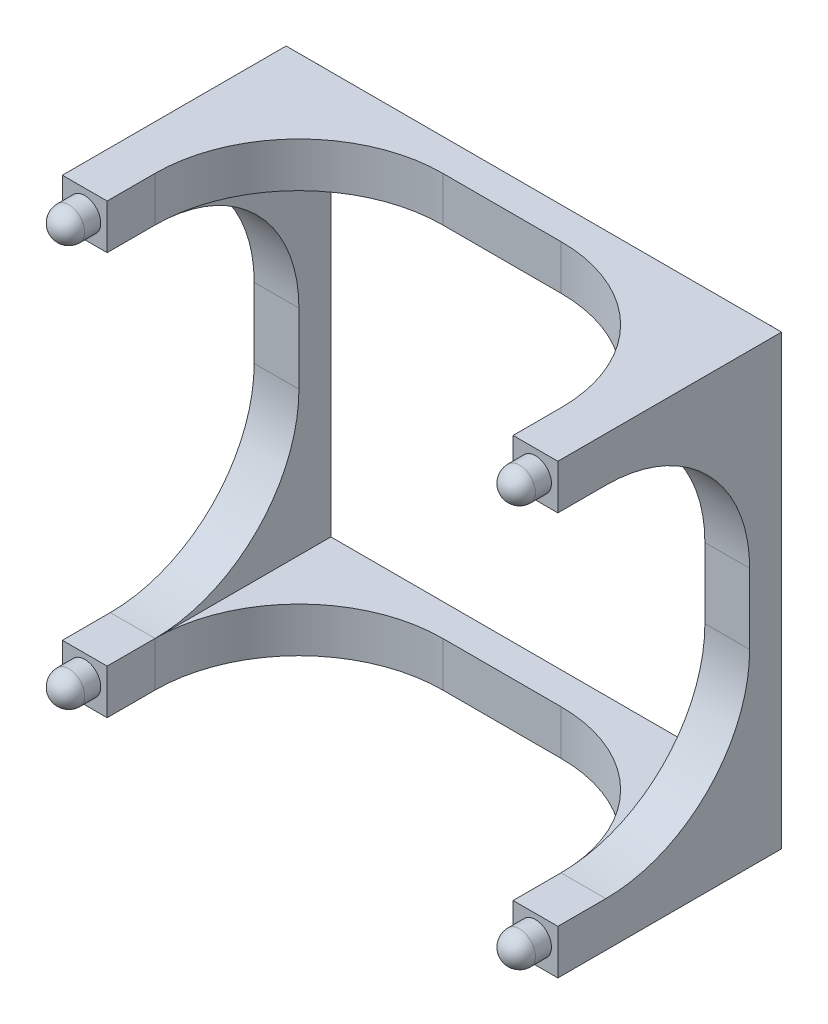
ISO-10303-21;
HEADER;
FILE_DESCRIPTION(('STEP AP214'),'2;1');
FILE_NAME('part.step','',(''),(''),'','','');
FILE_SCHEMA(('AUTOMOTIVE_DESIGN { 1 0 10303 214 1 1 1 1 }'));
ENDSEC;
DATA;
#1=APPLICATION_CONTEXT('core data for automotive mechanical design processes');
#2=APPLICATION_PROTOCOL_DEFINITION('international standard','automotive_design',2000,#1);
#3=PRODUCT_CONTEXT('',#1,'mechanical');
#4=PRODUCT('Part','Part','',(#3));
#5=PRODUCT_RELATED_PRODUCT_CATEGORY('part','',(#4));
#6=PRODUCT_DEFINITION_FORMATION('','',#4);
#7=PRODUCT_DEFINITION_CONTEXT('part definition',#1,'design');
#8=PRODUCT_DEFINITION('design','',#6,#7);
#9=PRODUCT_DEFINITION_SHAPE('','',#8);
#10=(LENGTH_UNIT() NAMED_UNIT(*) SI_UNIT(.MILLI.,.METRE.));
#11=(NAMED_UNIT(*) PLANE_ANGLE_UNIT() SI_UNIT($,.RADIAN.));
#12=(NAMED_UNIT(*) SI_UNIT($,.STERADIAN.) SOLID_ANGLE_UNIT());
#13=UNCERTAINTY_MEASURE_WITH_UNIT(LENGTH_MEASURE(1.E-05),#10,'distance_accuracy_value','');
#14=(GEOMETRIC_REPRESENTATION_CONTEXT(3) GLOBAL_UNCERTAINTY_ASSIGNED_CONTEXT((#13)) GLOBAL_UNIT_ASSIGNED_CONTEXT((#10,
#11,#12)) REPRESENTATION_CONTEXT('',''));
#15=CARTESIAN_POINT('',(0.,0.,0.));
#16=DIRECTION('',(0.,0.,1.));
#17=DIRECTION('',(1.,0.,0.));
#18=AXIS2_PLACEMENT_3D('',#15,#16,#17);
#19=CARTESIAN_POINT('',(63.5,56.,70.));
#20=DIRECTION('',(0.,1.,0.));
#21=DIRECTION('',(0.,0.,1.));
#22=AXIS2_PLACEMENT_3D('',#19,#20,#21);
#23=PLANE('',#22);
#24=DIRECTION('',(0.,0.,-1.));
#25=VECTOR('',#24,1.);
#26=CARTESIAN_POINT('',(-77.5,56.,70.));
#27=LINE('',#26,#25);
#28=CARTESIAN_POINT('',(-77.5,56.,70.));
#29=VERTEX_POINT('',#28);
#30=CARTESIAN_POINT('',(-77.5,56.,55.));
#31=VERTEX_POINT('',#30);
#32=EDGE_CURVE('E290',#29,#31,#27,.T.);
#33=ORIENTED_EDGE('',*,*,#32,.T.);
#34=DIRECTION('',(1.,0.,0.));
#35=VECTOR('',#34,1.);
#36=CARTESIAN_POINT('',(-63.5,56.,55.));
#37=LINE('',#36,#35);
#38=CARTESIAN_POINT('',(-63.5,56.,55.));
#39=VERTEX_POINT('',#38);
#40=EDGE_CURVE('E438',#31,#39,#37,.T.);
#41=ORIENTED_EDGE('',*,*,#40,.T.);
#42=DIRECTION('',(0.,0.,-1.));
#43=VECTOR('',#42,1.);
#44=CARTESIAN_POINT('',(-63.5,56.,70.));
#45=LINE('',#44,#43);
#46=CARTESIAN_POINT('',(-63.5,56.,70.));
#47=VERTEX_POINT('',#46);
#48=EDGE_CURVE('E287',#47,#39,#45,.T.);
#49=ORIENTED_EDGE('',*,*,#48,.F.);
#50=DIRECTION('',(1.,0.,0.));
#51=VECTOR('',#50,1.);
#52=CARTESIAN_POINT('',(-63.5,56.,70.));
#53=LINE('',#52,#51);
#54=EDGE_CURVE('E285',#29,#47,#53,.T.);
#55=ORIENTED_EDGE('',*,*,#54,.F.);
#56=EDGE_LOOP('',(#33,#41,#49,#55));
#57=FACE_BOUND('',#56,.T.);
#58=ADVANCED_FACE('F33',(#57),#23,.F.);
#59=DIRECTION('',(0.,0.,-1.));
#60=VECTOR('',#59,1.);
#61=CARTESIAN_POINT('',(63.5,56.,70.));
#62=LINE('',#61,#60);
#63=CARTESIAN_POINT('',(63.5,56.,70.));
#64=VERTEX_POINT('',#63);
#65=CARTESIAN_POINT('',(63.5,56.,55.));
#66=VERTEX_POINT('',#65);
#67=EDGE_CURVE('E274',#64,#66,#62,.T.);
#68=ORIENTED_EDGE('',*,*,#67,.T.);
#69=DIRECTION('',(1.,0.,0.));
#70=VECTOR('',#69,1.);
#71=CARTESIAN_POINT('',(77.5,56.,55.));
#72=LINE('',#71,#70);
#73=CARTESIAN_POINT('',(77.5,56.,55.));
#74=VERTEX_POINT('',#73);
#75=EDGE_CURVE('E435',#66,#74,#72,.T.);
#76=ORIENTED_EDGE('',*,*,#75,.T.);
#77=DIRECTION('',(0.,0.,-1.));
#78=VECTOR('',#77,1.);
#79=CARTESIAN_POINT('',(77.5,56.,70.));
#80=LINE('',#79,#78);
#81=CARTESIAN_POINT('',(77.5,56.,70.));
#82=VERTEX_POINT('',#81);
#83=EDGE_CURVE('E271',#82,#74,#80,.T.);
#84=ORIENTED_EDGE('',*,*,#83,.F.);
#85=DIRECTION('',(1.,0.,0.));
#86=VECTOR('',#85,1.);
#87=CARTESIAN_POINT('',(63.5,56.,70.));
#88=LINE('',#87,#86);
#89=EDGE_CURVE('E261',#64,#82,#88,.T.);
#90=ORIENTED_EDGE('',*,*,#89,.F.);
#91=EDGE_LOOP('',(#68,#76,#84,#90));
#92=FACE_BOUND('',#91,.T.);
#93=ADVANCED_FACE('F478',(#92),#23,.F.);
#94=CARTESIAN_POINT('',(-63.5,-56.,70.));
#95=DIRECTION('',(0.,-1.,0.));
#96=DIRECTION('',(0.,0.,-1.));
#97=AXIS2_PLACEMENT_3D('',#94,#95,#96);
#98=PLANE('',#97);
#99=DIRECTION('',(0.,0.,-1.));
#100=VECTOR('',#99,1.);
#101=CARTESIAN_POINT('',(77.5,-56.,70.));
#102=LINE('',#101,#100);
#103=CARTESIAN_POINT('',(77.5,-56.,70.));
#104=VERTEX_POINT('',#103);
#105=CARTESIAN_POINT('',(77.5,-56.,55.));
#106=VERTEX_POINT('',#105);
#107=EDGE_CURVE('E252',#104,#106,#102,.T.);
#108=ORIENTED_EDGE('',*,*,#107,.T.);
#109=DIRECTION('',(-1.,0.,0.));
#110=VECTOR('',#109,1.);
#111=CARTESIAN_POINT('',(63.5,-56.,55.));
#112=LINE('',#111,#110);
#113=CARTESIAN_POINT('',(63.5,-56.,55.));
#114=VERTEX_POINT('',#113);
#115=EDGE_CURVE('E428',#106,#114,#112,.T.);
#116=ORIENTED_EDGE('',*,*,#115,.T.);
#117=DIRECTION('',(0.,0.,-1.));
#118=VECTOR('',#117,1.);
#119=CARTESIAN_POINT('',(63.5,-56.,70.));
#120=LINE('',#119,#118);
#121=CARTESIAN_POINT('',(63.5,-56.,70.));
#122=VERTEX_POINT('',#121);
#123=EDGE_CURVE('E249',#122,#114,#120,.T.);
#124=ORIENTED_EDGE('',*,*,#123,.F.);
#125=DIRECTION('',(-1.,0.,0.));
#126=VECTOR('',#125,1.);
#127=CARTESIAN_POINT('',(63.5,-56.,70.));
#128=LINE('',#127,#126);
#129=EDGE_CURVE('E247',#104,#122,#128,.T.);
#130=ORIENTED_EDGE('',*,*,#129,.F.);
#131=EDGE_LOOP('',(#108,#116,#124,#130));
#132=FACE_BOUND('',#131,.T.);
#133=ADVANCED_FACE('F520',(#132),#98,.F.);
#134=DIRECTION('',(0.,0.,-1.));
#135=VECTOR('',#134,1.);
#136=CARTESIAN_POINT('',(-63.5,-56.,70.));
#137=LINE('',#136,#135);
#138=CARTESIAN_POINT('',(-63.5,-56.,70.));
#139=VERTEX_POINT('',#138);
#140=CARTESIAN_POINT('',(-63.5,-56.,55.));
#141=VERTEX_POINT('',#140);
#142=EDGE_CURVE('E211',#139,#141,#137,.T.);
#143=ORIENTED_EDGE('',*,*,#142,.T.);
#144=DIRECTION('',(-1.,0.,0.));
#145=VECTOR('',#144,1.);
#146=CARTESIAN_POINT('',(-77.5,-56.,55.));
#147=LINE('',#146,#145);
#148=CARTESIAN_POINT('',(-77.5,-56.,55.));
#149=VERTEX_POINT('',#148);
#150=EDGE_CURVE('E387',#141,#149,#147,.T.);
#151=ORIENTED_EDGE('',*,*,#150,.T.);
#152=DIRECTION('',(0.,0.,-1.));
#153=VECTOR('',#152,1.);
#154=CARTESIAN_POINT('',(-77.5,-56.,70.));
#155=LINE('',#154,#153);
#156=CARTESIAN_POINT('',(-77.5,-56.,70.));
#157=VERTEX_POINT('',#156);
#158=EDGE_CURVE('E214',#157,#149,#155,.T.);
#159=ORIENTED_EDGE('',*,*,#158,.F.);
#160=DIRECTION('',(-1.,0.,0.));
#161=VECTOR('',#160,1.);
#162=CARTESIAN_POINT('',(-63.5,-56.,70.));
#163=LINE('',#162,#161);
#164=EDGE_CURVE('E206',#139,#157,#163,.T.);
#165=ORIENTED_EDGE('',*,*,#164,.F.);
#166=EDGE_LOOP('',(#143,#151,#159,#165));
#167=FACE_BOUND('',#166,.T.);
#168=ADVANCED_FACE('F208',(#167),#98,.F.);
#169=CARTESIAN_POINT('',(0.,0.,10.));
#170=DIRECTION('',(0.,0.,-1.));
#171=DIRECTION('',(-1.,0.,0.));
#172=AXIS2_PLACEMENT_3D('',#169,#170,#171);
#173=PLANE('',#172);
#174=DIRECTION('',(1.,0.,0.));
#175=VECTOR('',#174,1.);
#176=CARTESIAN_POINT('',(-77.5,-70.,10.));
#177=LINE('',#176,#175);
#178=CARTESIAN_POINT('',(-18.5,-70.,10.));
#179=VERTEX_POINT('',#178);
#180=CARTESIAN_POINT('',(18.5,-70.,10.));
#181=VERTEX_POINT('',#180);
#182=EDGE_CURVE('E339',#179,#181,#177,.T.);
#183=ORIENTED_EDGE('',*,*,#182,.T.);
#184=DIRECTION('',(0.,-1.,0.));
#185=VECTOR('',#184,1.);
#186=CARTESIAN_POINT('',(18.5,-56.,10.));
#187=LINE('',#186,#185);
#188=CARTESIAN_POINT('',(18.5,-56.,10.));
#189=VERTEX_POINT('',#188);
#190=EDGE_CURVE('E411',#181,#189,#187,.F.);
#191=ORIENTED_EDGE('',*,*,#190,.T.);
#192=DIRECTION('',(1.,0.,0.));
#193=VECTOR('',#192,1.);
#194=CARTESIAN_POINT('',(-63.5,-56.,10.));
#195=LINE('',#194,#193);
#196=CARTESIAN_POINT('',(-18.5,-56.,10.));
#197=VERTEX_POINT('',#196);
#198=EDGE_CURVE('E306',#197,#189,#195,.T.);
#199=ORIENTED_EDGE('',*,*,#198,.F.);
#200=DIRECTION('',(0.,1.,0.));
#201=VECTOR('',#200,1.);
#202=CARTESIAN_POINT('',(-18.5,-70.,10.));
#203=LINE('',#202,#201);
#204=EDGE_CURVE('E380',#197,#179,#203,.F.);
#205=ORIENTED_EDGE('',*,*,#204,.T.);
#206=EDGE_LOOP('',(#183,#191,#199,#205));
#207=FACE_BOUND('',#206,.T.);
#208=ADVANCED_FACE('F556',(#207),#173,.F.);
#209=DIRECTION('',(0.,-1.,0.));
#210=VECTOR('',#209,1.);
#211=CARTESIAN_POINT('',(-63.5,-56.,10.));
#212=LINE('',#211,#210);
#213=CARTESIAN_POINT('',(-63.5,11.,10.));
#214=VERTEX_POINT('',#213);
#215=CARTESIAN_POINT('',(-63.5,-11.,10.));
#216=VERTEX_POINT('',#215);
#217=EDGE_CURVE('E304',#214,#216,#212,.T.);
#218=ORIENTED_EDGE('',*,*,#217,.F.);
#219=DIRECTION('',(1.,0.,0.));
#220=VECTOR('',#219,1.);
#221=CARTESIAN_POINT('',(-77.5,11.,10.));
#222=LINE('',#221,#220);
#223=CARTESIAN_POINT('',(-77.5,11.,10.));
#224=VERTEX_POINT('',#223);
#225=EDGE_CURVE('E55',#214,#224,#222,.F.);
#226=ORIENTED_EDGE('',*,*,#225,.T.);
#227=DIRECTION('',(0.,-1.,0.));
#228=VECTOR('',#227,1.);
#229=CARTESIAN_POINT('',(-77.5,-70.,10.));
#230=LINE('',#229,#228);
#231=CARTESIAN_POINT('',(-77.5,-11.,10.));
#232=VERTEX_POINT('',#231);
#233=EDGE_CURVE('E337',#224,#232,#230,.T.);
#234=ORIENTED_EDGE('',*,*,#233,.T.);
#235=DIRECTION('',(-1.,0.,0.));
#236=VECTOR('',#235,1.);
#237=CARTESIAN_POINT('',(-63.5,-11.,10.));
#238=LINE('',#237,#236);
#239=EDGE_CURVE('E389',#232,#216,#238,.F.);
#240=ORIENTED_EDGE('',*,*,#239,.T.);
#241=EDGE_LOOP('',(#218,#226,#234,#240));
#242=FACE_BOUND('',#241,.T.);
#243=ADVANCED_FACE('F546',(#242),#173,.F.);
#244=DIRECTION('',(0.,1.,0.));
#245=VECTOR('',#244,1.);
#246=CARTESIAN_POINT('',(63.5,-56.,10.));
#247=LINE('',#246,#245);
#248=CARTESIAN_POINT('',(63.5,-11.,10.));
#249=VERTEX_POINT('',#248);
#250=CARTESIAN_POINT('',(63.5,11.,10.));
#251=VERTEX_POINT('',#250);
#252=EDGE_CURVE('E297',#249,#251,#247,.T.);
#253=ORIENTED_EDGE('',*,*,#252,.F.);
#254=DIRECTION('',(-1.,0.,0.));
#255=VECTOR('',#254,1.);
#256=CARTESIAN_POINT('',(77.5,-11.,10.));
#257=LINE('',#256,#255);
#258=CARTESIAN_POINT('',(77.5,-11.,10.));
#259=VERTEX_POINT('',#258);
#260=EDGE_CURVE('E433',#249,#259,#257,.F.);
#261=ORIENTED_EDGE('',*,*,#260,.T.);
#262=DIRECTION('',(0.,1.,0.));
#263=VECTOR('',#262,1.);
#264=CARTESIAN_POINT('',(77.5,-70.,10.));
#265=LINE('',#264,#263);
#266=CARTESIAN_POINT('',(77.5,11.,10.));
#267=VERTEX_POINT('',#266);
#268=EDGE_CURVE('E330',#259,#267,#265,.T.);
#269=ORIENTED_EDGE('',*,*,#268,.T.);
#270=DIRECTION('',(1.,0.,0.));
#271=VECTOR('',#270,1.);
#272=CARTESIAN_POINT('',(63.5,11.,10.));
#273=LINE('',#272,#271);
#274=EDGE_CURVE('E431',#267,#251,#273,.F.);
#275=ORIENTED_EDGE('',*,*,#274,.T.);
#276=EDGE_LOOP('',(#253,#261,#269,#275));
#277=FACE_BOUND('',#276,.T.);
#278=ADVANCED_FACE('F459',(#277),#173,.F.);
#279=DIRECTION('',(-1.,0.,0.));
#280=VECTOR('',#279,1.);
#281=CARTESIAN_POINT('',(-77.5,70.,10.));
#282=LINE('',#281,#280);
#283=CARTESIAN_POINT('',(18.5,70.,10.));
#284=VERTEX_POINT('',#283);
#285=CARTESIAN_POINT('',(-18.5,70.,10.));
#286=VERTEX_POINT('',#285);
#287=EDGE_CURVE('E333',#284,#286,#282,.T.);
#288=ORIENTED_EDGE('',*,*,#287,.T.);
#289=DIRECTION('',(0.,1.,0.));
#290=VECTOR('',#289,1.);
#291=CARTESIAN_POINT('',(-18.5,56.,10.));
#292=LINE('',#291,#290);
#293=CARTESIAN_POINT('',(-18.5,56.,10.));
#294=VERTEX_POINT('',#293);
#295=EDGE_CURVE('E403',#286,#294,#292,.F.);
#296=ORIENTED_EDGE('',*,*,#295,.T.);
#297=DIRECTION('',(-1.,0.,0.));
#298=VECTOR('',#297,1.);
#299=CARTESIAN_POINT('',(-63.5,56.,10.));
#300=LINE('',#299,#298);
#301=CARTESIAN_POINT('',(18.5,56.,10.));
#302=VERTEX_POINT('',#301);
#303=EDGE_CURVE('E300',#302,#294,#300,.T.);
#304=ORIENTED_EDGE('',*,*,#303,.F.);
#305=DIRECTION('',(0.,-1.,0.));
#306=VECTOR('',#305,1.);
#307=CARTESIAN_POINT('',(18.5,70.,10.));
#308=LINE('',#307,#306);
#309=EDGE_CURVE('E401',#302,#284,#308,.F.);
#310=ORIENTED_EDGE('',*,*,#309,.T.);
#311=EDGE_LOOP('',(#288,#296,#304,#310));
#312=FACE_BOUND('',#311,.T.);
#313=ADVANCED_FACE('F487',(#312),#173,.F.);
#314=CARTESIAN_POINT('',(0.,0.,0.));
#315=DIRECTION('',(0.,0.,-1.));
#316=DIRECTION('',(-1.,0.,0.));
#317=AXIS2_PLACEMENT_3D('',#314,#315,#316);
#318=PLANE('',#317);
#319=CARTESIAN_POINT('',(70.5,-62.673227844293,0.));
#320=DIRECTION('',(0.,0.,-1.));
#321=DIRECTION('',(-1.,0.,0.));
#322=AXIS2_PLACEMENT_3D('',#319,#320,#321);
#323=CIRCLE('',#322,5.00000000000001);
#324=CARTESIAN_POINT('',(65.5,-62.673227844293,0.));
#325=VERTEX_POINT('',#324);
#326=EDGE_CURVE('E574',#325,#325,#323,.T.);
#327=ORIENTED_EDGE('',*,*,#326,.F.);
#328=EDGE_LOOP('',(#327));
#329=FACE_BOUND('',#328,.T.);
#330=CARTESIAN_POINT('',(70.5,63.,0.));
#331=DIRECTION('',(0.,0.,-1.));
#332=DIRECTION('',(-1.,0.,0.));
#333=AXIS2_PLACEMENT_3D('',#330,#331,#332);
#334=CIRCLE('',#333,5.00000000000001);
#335=CARTESIAN_POINT('',(65.5,63.,0.));
#336=VERTEX_POINT('',#335);
#337=EDGE_CURVE('E571',#336,#336,#334,.T.);
#338=ORIENTED_EDGE('',*,*,#337,.F.);
#339=EDGE_LOOP('',(#338));
#340=FACE_BOUND('',#339,.T.);
#341=CARTESIAN_POINT('',(-70.5,63.,0.));
#342=DIRECTION('',(0.,0.,-1.));
#343=DIRECTION('',(-1.,0.,0.));
#344=AXIS2_PLACEMENT_3D('',#341,#342,#343);
#345=CIRCLE('',#344,5.00000000000001);
#346=CARTESIAN_POINT('',(-75.5,63.,0.));
#347=VERTEX_POINT('',#346);
#348=EDGE_CURVE('E568',#347,#347,#345,.T.);
#349=ORIENTED_EDGE('',*,*,#348,.F.);
#350=EDGE_LOOP('',(#349));
#351=FACE_BOUND('',#350,.T.);
#352=CARTESIAN_POINT('',(-70.5,-62.673227844293,0.));
#353=DIRECTION('',(0.,0.,-1.));
#354=DIRECTION('',(-1.,0.,0.));
#355=AXIS2_PLACEMENT_3D('',#352,#353,#354);
#356=CIRCLE('',#355,5.00000000000001);
#357=CARTESIAN_POINT('',(-75.5,-62.673227844293,0.));
#358=VERTEX_POINT('',#357);
#359=EDGE_CURVE('E565',#358,#358,#356,.T.);
#360=ORIENTED_EDGE('',*,*,#359,.F.);
#361=EDGE_LOOP('',(#360));
#362=FACE_BOUND('',#361,.T.);
#363=DIRECTION('',(0.,1.,0.));
#364=VECTOR('',#363,1.);
#365=CARTESIAN_POINT('',(77.5,-70.,0.));
#366=LINE('',#365,#364);
#367=CARTESIAN_POINT('',(77.5,-70.,0.));
#368=VERTEX_POINT('',#367);
#369=CARTESIAN_POINT('',(77.5,70.,0.));
#370=VERTEX_POINT('',#369);
#371=EDGE_CURVE('E329',#368,#370,#366,.T.);
#372=ORIENTED_EDGE('',*,*,#371,.F.);
#373=DIRECTION('',(1.,0.,0.));
#374=VECTOR('',#373,1.);
#375=CARTESIAN_POINT('',(-77.5,-70.,0.));
#376=LINE('',#375,#374);
#377=CARTESIAN_POINT('',(-77.5,-70.,0.));
#378=VERTEX_POINT('',#377);
#379=EDGE_CURVE('E334',#378,#368,#376,.T.);
#380=ORIENTED_EDGE('',*,*,#379,.F.);
#381=DIRECTION('',(0.,-1.,0.));
#382=VECTOR('',#381,1.);
#383=CARTESIAN_POINT('',(-77.5,-70.,0.));
#384=LINE('',#383,#382);
#385=CARTESIAN_POINT('',(-77.5,70.,0.));
#386=VERTEX_POINT('',#385);
#387=EDGE_CURVE('E347',#386,#378,#384,.T.);
#388=ORIENTED_EDGE('',*,*,#387,.F.);
#389=DIRECTION('',(-1.,0.,0.));
#390=VECTOR('',#389,1.);
#391=CARTESIAN_POINT('',(-77.5,70.,0.));
#392=LINE('',#391,#390);
#393=EDGE_CURVE('E345',#370,#386,#392,.T.);
#394=ORIENTED_EDGE('',*,*,#393,.F.);
#395=EDGE_LOOP('',(#372,#380,#388,#394));
#396=FACE_BOUND('',#395,.T.);
#397=DIRECTION('',(1.,0.,0.));
#398=VECTOR('',#397,1.);
#399=CARTESIAN_POINT('',(-63.5,-56.,0.));
#400=LINE('',#399,#398);
#401=CARTESIAN_POINT('',(-63.5,-56.,0.));
#402=VERTEX_POINT('',#401);
#403=CARTESIAN_POINT('',(63.5,-56.,0.));
#404=VERTEX_POINT('',#403);
#405=EDGE_CURVE('E301',#402,#404,#400,.T.);
#406=ORIENTED_EDGE('',*,*,#405,.T.);
#407=DIRECTION('',(0.,1.,0.));
#408=VECTOR('',#407,1.);
#409=CARTESIAN_POINT('',(63.5,-56.,0.));
#410=LINE('',#409,#408);
#411=CARTESIAN_POINT('',(63.5,56.,0.));
#412=VERTEX_POINT('',#411);
#413=EDGE_CURVE('E296',#404,#412,#410,.T.);
#414=ORIENTED_EDGE('',*,*,#413,.T.);
#415=DIRECTION('',(-1.,0.,0.));
#416=VECTOR('',#415,1.);
#417=CARTESIAN_POINT('',(-63.5,56.,0.));
#418=LINE('',#417,#416);
#419=CARTESIAN_POINT('',(-63.5,56.,0.));
#420=VERTEX_POINT('',#419);
#421=EDGE_CURVE('E312',#412,#420,#418,.T.);
#422=ORIENTED_EDGE('',*,*,#421,.T.);
#423=DIRECTION('',(0.,-1.,0.));
#424=VECTOR('',#423,1.);
#425=CARTESIAN_POINT('',(-63.5,-56.,0.));
#426=LINE('',#425,#424);
#427=EDGE_CURVE('E315',#420,#402,#426,.T.);
#428=ORIENTED_EDGE('',*,*,#427,.T.);
#429=EDGE_LOOP('',(#406,#414,#422,#428));
#430=FACE_BOUND('',#429,.T.);
#431=ADVANCED_FACE('F497',(#329,#340,#351,#362,#396,#430),#318,.T.);
#432=CARTESIAN_POINT('',(77.5,-70.,10.));
#433=DIRECTION('',(-1.,0.,0.));
#434=DIRECTION('',(0.,0.,1.));
#435=AXIS2_PLACEMENT_3D('',#432,#433,#434);
#436=PLANE('',#435);
#437=ORIENTED_EDGE('',*,*,#371,.T.);
#438=DIRECTION('',(0.,0.,-1.));
#439=VECTOR('',#438,1.);
#440=CARTESIAN_POINT('',(77.5,70.,10.));
#441=LINE('',#440,#439);
#442=CARTESIAN_POINT('',(77.5,70.,70.));
#443=VERTEX_POINT('',#442);
#444=EDGE_CURVE('E358',#443,#370,#441,.T.);
#445=ORIENTED_EDGE('',*,*,#444,.F.);
#446=DIRECTION('',(0.,1.,0.));
#447=VECTOR('',#446,1.);
#448=CARTESIAN_POINT('',(77.5,56.,70.));
#449=LINE('',#448,#447);
#450=EDGE_CURVE('E263',#82,#443,#449,.T.);
#451=ORIENTED_EDGE('',*,*,#450,.F.);
#452=ORIENTED_EDGE('',*,*,#83,.T.);
#453=CARTESIAN_POINT('',(77.5,11.,55.));
#454=DIRECTION('',(-1.,0.,0.));
#455=DIRECTION('',(0.,0.,1.));
#456=AXIS2_PLACEMENT_3D('',#453,#454,#455);
#457=CIRCLE('',#456,45.);
#458=EDGE_CURVE('E41',#74,#267,#457,.T.);
#459=ORIENTED_EDGE('',*,*,#458,.T.);
#460=ORIENTED_EDGE('',*,*,#268,.F.);
#461=CARTESIAN_POINT('',(77.5,-11.,55.));
#462=DIRECTION('',(-1.,0.,0.));
#463=DIRECTION('',(0.,0.,1.));
#464=AXIS2_PLACEMENT_3D('',#461,#462,#463);
#465=CIRCLE('',#464,45.);
#466=EDGE_CURVE('E444',#259,#106,#465,.T.);
#467=ORIENTED_EDGE('',*,*,#466,.T.);
#468=ORIENTED_EDGE('',*,*,#107,.F.);
#469=DIRECTION('',(0.,1.,0.));
#470=VECTOR('',#469,1.);
#471=CARTESIAN_POINT('',(77.5,-56.,70.));
#472=LINE('',#471,#470);
#473=CARTESIAN_POINT('',(77.5,-70.,70.));
#474=VERTEX_POINT('',#473);
#475=EDGE_CURVE('E245',#474,#104,#472,.T.);
#476=ORIENTED_EDGE('',*,*,#475,.F.);
#477=DIRECTION('',(0.,0.,-1.));
#478=VECTOR('',#477,1.);
#479=CARTESIAN_POINT('',(77.5,-70.,10.));
#480=LINE('',#479,#478);
#481=EDGE_CURVE('E342',#474,#368,#480,.T.);
#482=ORIENTED_EDGE('',*,*,#481,.T.);
#483=EDGE_LOOP('',(#437,#445,#451,#452,#459,#460,#467,#468,#476,#482));
#484=FACE_BOUND('',#483,.T.);
#485=ADVANCED_FACE('F450',(#484),#436,.F.);
#486=CARTESIAN_POINT('',(-77.5,70.,10.));
#487=DIRECTION('',(0.,-1.,0.));
#488=DIRECTION('',(0.,0.,-1.));
#489=AXIS2_PLACEMENT_3D('',#486,#487,#488);
#490=PLANE('',#489);
#491=ORIENTED_EDGE('',*,*,#393,.T.);
#492=DIRECTION('',(0.,0.,-1.));
#493=VECTOR('',#492,1.);
#494=CARTESIAN_POINT('',(-77.5,70.,10.));
#495=LINE('',#494,#493);
#496=CARTESIAN_POINT('',(-77.5,70.,70.));
#497=VERTEX_POINT('',#496);
#498=EDGE_CURVE('E355',#497,#386,#495,.T.);
#499=ORIENTED_EDGE('',*,*,#498,.F.);
#500=DIRECTION('',(-1.,0.,0.));
#501=VECTOR('',#500,1.);
#502=CARTESIAN_POINT('',(-63.5,70.,70.));
#503=LINE('',#502,#501);
#504=CARTESIAN_POINT('',(-63.5,70.,70.));
#505=VERTEX_POINT('',#504);
#506=EDGE_CURVE('E280',#505,#497,#503,.T.);
#507=ORIENTED_EDGE('',*,*,#506,.F.);
#508=DIRECTION('',(0.,0.,-1.));
#509=VECTOR('',#508,1.);
#510=CARTESIAN_POINT('',(-63.5,70.,70.));
#511=LINE('',#510,#509);
#512=CARTESIAN_POINT('',(-63.5,70.,55.));
#513=VERTEX_POINT('',#512);
#514=EDGE_CURVE('E293',#505,#513,#511,.T.);
#515=ORIENTED_EDGE('',*,*,#514,.T.);
#516=CARTESIAN_POINT('',(-18.5,70.,55.));
#517=DIRECTION('',(0.,-1.,0.));
#518=DIRECTION('',(0.,0.,-1.));
#519=AXIS2_PLACEMENT_3D('',#516,#517,#518);
#520=CIRCLE('',#519,45.);
#521=EDGE_CURVE('E413',#513,#286,#520,.T.);
#522=ORIENTED_EDGE('',*,*,#521,.T.);
#523=ORIENTED_EDGE('',*,*,#287,.F.);
#524=CARTESIAN_POINT('',(18.5,70.,55.));
#525=DIRECTION('',(0.,-1.,0.));
#526=DIRECTION('',(0.,0.,-1.));
#527=AXIS2_PLACEMENT_3D('',#524,#525,#526);
#528=CIRCLE('',#527,45.);
#529=CARTESIAN_POINT('',(63.5,70.,55.));
#530=VERTEX_POINT('',#529);
#531=EDGE_CURVE('E421',#284,#530,#528,.T.);
#532=ORIENTED_EDGE('',*,*,#531,.T.);
#533=DIRECTION('',(0.,0.,-1.));
#534=VECTOR('',#533,1.);
#535=CARTESIAN_POINT('',(63.5,70.,70.));
#536=LINE('',#535,#534);
#537=CARTESIAN_POINT('',(63.5,70.,70.));
#538=VERTEX_POINT('',#537);
#539=EDGE_CURVE('E268',#538,#530,#536,.T.);
#540=ORIENTED_EDGE('',*,*,#539,.F.);
#541=DIRECTION('',(-1.,0.,0.));
#542=VECTOR('',#541,1.);
#543=CARTESIAN_POINT('',(63.5,70.,70.));
#544=LINE('',#543,#542);
#545=EDGE_CURVE('E266',#443,#538,#544,.T.);
#546=ORIENTED_EDGE('',*,*,#545,.F.);
#547=ORIENTED_EDGE('',*,*,#444,.T.);
#548=EDGE_LOOP('',(#491,#499,#507,#515,#522,#523,#532,#540,#546,#547));
#549=FACE_BOUND('',#548,.T.);
#550=ADVANCED_FACE('F483',(#549),#490,.F.);
#551=CARTESIAN_POINT('',(-77.5,-70.,10.));
#552=DIRECTION('',(1.,0.,0.));
#553=DIRECTION('',(0.,0.,-1.));
#554=AXIS2_PLACEMENT_3D('',#551,#552,#553);
#555=PLANE('',#554);
#556=ORIENTED_EDGE('',*,*,#387,.T.);
#557=DIRECTION('',(0.,0.,-1.));
#558=VECTOR('',#557,1.);
#559=CARTESIAN_POINT('',(-77.5,-70.,10.));
#560=LINE('',#559,#558);
#561=CARTESIAN_POINT('',(-77.5,-70.,70.));
#562=VERTEX_POINT('',#561);
#563=EDGE_CURVE('E352',#562,#378,#560,.T.);
#564=ORIENTED_EDGE('',*,*,#563,.F.);
#565=DIRECTION('',(0.,-1.,0.));
#566=VECTOR('',#565,1.);
#567=CARTESIAN_POINT('',(-77.5,-56.,70.));
#568=LINE('',#567,#566);
#569=EDGE_CURVE('E218',#157,#562,#568,.T.);
#570=ORIENTED_EDGE('',*,*,#569,.F.);
#571=ORIENTED_EDGE('',*,*,#158,.T.);
#572=CARTESIAN_POINT('',(-77.5,-11.,55.));
#573=DIRECTION('',(1.,0.,0.));
#574=DIRECTION('',(0.,0.,-1.));
#575=AXIS2_PLACEMENT_3D('',#572,#573,#574);
#576=CIRCLE('',#575,45.);
#577=EDGE_CURVE('E392',#149,#232,#576,.T.);
#578=ORIENTED_EDGE('',*,*,#577,.T.);
#579=ORIENTED_EDGE('',*,*,#233,.F.);
#580=CARTESIAN_POINT('',(-77.5,11.,55.));
#581=DIRECTION('',(1.,0.,0.));
#582=DIRECTION('',(0.,0.,-1.));
#583=AXIS2_PLACEMENT_3D('',#580,#581,#582);
#584=CIRCLE('',#583,45.);
#585=EDGE_CURVE('E447',#224,#31,#584,.T.);
#586=ORIENTED_EDGE('',*,*,#585,.T.);
#587=ORIENTED_EDGE('',*,*,#32,.F.);
#588=DIRECTION('',(0.,-1.,0.));
#589=VECTOR('',#588,1.);
#590=CARTESIAN_POINT('',(-77.5,56.,70.));
#591=LINE('',#590,#589);
#592=EDGE_CURVE('E283',#497,#29,#591,.T.);
#593=ORIENTED_EDGE('',*,*,#592,.F.);
#594=ORIENTED_EDGE('',*,*,#498,.T.);
#595=EDGE_LOOP('',(#556,#564,#570,#571,#578,#579,#586,#587,#593,#594));
#596=FACE_BOUND('',#595,.T.);
#597=ADVANCED_FACE('F530',(#596),#555,.F.);
#598=CARTESIAN_POINT('',(-77.5,-70.,10.));
#599=DIRECTION('',(0.,1.,0.));
#600=DIRECTION('',(0.,0.,1.));
#601=AXIS2_PLACEMENT_3D('',#598,#599,#600);
#602=PLANE('',#601);
#603=ORIENTED_EDGE('',*,*,#379,.T.);
#604=ORIENTED_EDGE('',*,*,#481,.F.);
#605=DIRECTION('',(1.,0.,0.));
#606=VECTOR('',#605,1.);
#607=CARTESIAN_POINT('',(63.5,-70.,70.));
#608=LINE('',#607,#606);
#609=CARTESIAN_POINT('',(63.5,-70.,70.));
#610=VERTEX_POINT('',#609);
#611=EDGE_CURVE('E237',#610,#474,#608,.T.);
#612=ORIENTED_EDGE('',*,*,#611,.F.);
#613=DIRECTION('',(0.,0.,-1.));
#614=VECTOR('',#613,1.);
#615=CARTESIAN_POINT('',(63.5,-70.,70.));
#616=LINE('',#615,#614);
#617=CARTESIAN_POINT('',(63.5,-70.,55.));
#618=VERTEX_POINT('',#617);
#619=EDGE_CURVE('E255',#610,#618,#616,.T.);
#620=ORIENTED_EDGE('',*,*,#619,.T.);
#621=CARTESIAN_POINT('',(18.5,-70.,55.));
#622=DIRECTION('',(0.,1.,0.));
#623=DIRECTION('',(0.,0.,1.));
#624=AXIS2_PLACEMENT_3D('',#621,#622,#623);
#625=CIRCLE('',#624,45.);
#626=EDGE_CURVE('E423',#618,#181,#625,.T.);
#627=ORIENTED_EDGE('',*,*,#626,.T.);
#628=ORIENTED_EDGE('',*,*,#182,.F.);
#629=CARTESIAN_POINT('',(-18.5,-70.,55.));
#630=DIRECTION('',(0.,1.,0.));
#631=DIRECTION('',(0.,0.,1.));
#632=AXIS2_PLACEMENT_3D('',#629,#630,#631);
#633=CIRCLE('',#632,45.);
#634=CARTESIAN_POINT('',(-63.5,-70.,55.));
#635=VERTEX_POINT('',#634);
#636=EDGE_CURVE('E385',#179,#635,#633,.T.);
#637=ORIENTED_EDGE('',*,*,#636,.T.);
#638=DIRECTION('',(0.,0.,-1.));
#639=VECTOR('',#638,1.);
#640=CARTESIAN_POINT('',(-63.5,-70.,70.));
#641=LINE('',#640,#639);
#642=CARTESIAN_POINT('',(-63.5,-70.,70.));
#643=VERTEX_POINT('',#642);
#644=EDGE_CURVE('E239',#643,#635,#641,.T.);
#645=ORIENTED_EDGE('',*,*,#644,.F.);
#646=DIRECTION('',(1.,0.,0.));
#647=VECTOR('',#646,1.);
#648=CARTESIAN_POINT('',(-63.5,-70.,70.));
#649=LINE('',#648,#647);
#650=EDGE_CURVE('E224',#562,#643,#649,.T.);
#651=ORIENTED_EDGE('',*,*,#650,.F.);
#652=ORIENTED_EDGE('',*,*,#563,.T.);
#653=EDGE_LOOP('',(#603,#604,#612,#620,#627,#628,#637,#645,#651,#652));
#654=FACE_BOUND('',#653,.T.);
#655=ADVANCED_FACE('F512',(#654),#602,.F.);
#656=CARTESIAN_POINT('',(63.5,-56.,10.));
#657=DIRECTION('',(-1.,0.,0.));
#658=DIRECTION('',(0.,0.,1.));
#659=AXIS2_PLACEMENT_3D('',#656,#657,#658);
#660=PLANE('',#659);
#661=ORIENTED_EDGE('',*,*,#413,.F.);
#662=DIRECTION('',(0.,0.,-1.));
#663=VECTOR('',#662,1.);
#664=CARTESIAN_POINT('',(63.5,-56.,10.));
#665=LINE('',#664,#663);
#666=EDGE_CURVE('E309',#114,#404,#665,.T.);
#667=ORIENTED_EDGE('',*,*,#666,.F.);
#668=CARTESIAN_POINT('',(63.5,-11.,55.));
#669=DIRECTION('',(-1.,0.,0.));
#670=DIRECTION('',(0.,0.,1.));
#671=AXIS2_PLACEMENT_3D('',#668,#669,#670);
#672=CIRCLE('',#671,45.);
#673=EDGE_CURVE('E442',#114,#249,#672,.F.);
#674=ORIENTED_EDGE('',*,*,#673,.T.);
#675=ORIENTED_EDGE('',*,*,#252,.T.);
#676=CARTESIAN_POINT('',(63.5,11.,55.));
#677=DIRECTION('',(-1.,0.,0.));
#678=DIRECTION('',(0.,0.,1.));
#679=AXIS2_PLACEMENT_3D('',#676,#677,#678);
#680=CIRCLE('',#679,45.);
#681=EDGE_CURVE('E11',#251,#66,#680,.F.);
#682=ORIENTED_EDGE('',*,*,#681,.T.);
#683=DIRECTION('',(0.,0.,-1.));
#684=VECTOR('',#683,1.);
#685=CARTESIAN_POINT('',(63.5,56.,10.));
#686=LINE('',#685,#684);
#687=EDGE_CURVE('E326',#66,#412,#686,.T.);
#688=ORIENTED_EDGE('',*,*,#687,.T.);
#689=EDGE_LOOP('',(#661,#667,#674,#675,#682,#688));
#690=FACE_BOUND('',#689,.T.);
#691=ADVANCED_FACE('F465',(#690),#660,.T.);
#692=CARTESIAN_POINT('',(-63.5,-56.,10.));
#693=DIRECTION('',(1.,0.,0.));
#694=DIRECTION('',(0.,0.,-1.));
#695=AXIS2_PLACEMENT_3D('',#692,#693,#694);
#696=PLANE('',#695);
#697=ORIENTED_EDGE('',*,*,#427,.F.);
#698=DIRECTION('',(0.,0.,-1.));
#699=VECTOR('',#698,1.);
#700=CARTESIAN_POINT('',(-63.5,56.,10.));
#701=LINE('',#700,#699);
#702=EDGE_CURVE('E324',#39,#420,#701,.T.);
#703=ORIENTED_EDGE('',*,*,#702,.F.);
#704=CARTESIAN_POINT('',(-63.5,11.,55.));
#705=DIRECTION('',(1.,0.,0.));
#706=DIRECTION('',(0.,0.,-1.));
#707=AXIS2_PLACEMENT_3D('',#704,#705,#706);
#708=CIRCLE('',#707,45.);
#709=EDGE_CURVE('E48',#39,#214,#708,.F.);
#710=ORIENTED_EDGE('',*,*,#709,.T.);
#711=ORIENTED_EDGE('',*,*,#217,.T.);
#712=CARTESIAN_POINT('',(-63.5,-11.,55.));
#713=DIRECTION('',(1.,0.,0.));
#714=DIRECTION('',(0.,0.,-1.));
#715=AXIS2_PLACEMENT_3D('',#712,#713,#714);
#716=CIRCLE('',#715,45.);
#717=EDGE_CURVE('E395',#216,#141,#716,.F.);
#718=ORIENTED_EDGE('',*,*,#717,.T.);
#719=DIRECTION('',(0.,0.,-1.));
#720=VECTOR('',#719,1.);
#721=CARTESIAN_POINT('',(-63.5,-56.,10.));
#722=LINE('',#721,#720);
#723=EDGE_CURVE('E322',#141,#402,#722,.T.);
#724=ORIENTED_EDGE('',*,*,#723,.T.);
#725=EDGE_LOOP('',(#697,#703,#710,#711,#718,#724));
#726=FACE_BOUND('',#725,.T.);
#727=ADVANCED_FACE('F494',(#726),#696,.T.);
#728=CARTESIAN_POINT('',(-63.5,56.,70.));
#729=DIRECTION('',(-1.,0.,0.));
#730=DIRECTION('',(0.,0.,1.));
#731=AXIS2_PLACEMENT_3D('',#728,#729,#730);
#732=PLANE('',#731);
#733=ORIENTED_EDGE('',*,*,#48,.T.);
#734=DIRECTION('',(0.,1.,0.));
#735=VECTOR('',#734,1.);
#736=CARTESIAN_POINT('',(-63.5,70.,55.));
#737=LINE('',#736,#735);
#738=EDGE_CURVE('E398',#39,#513,#737,.T.);
#739=ORIENTED_EDGE('',*,*,#738,.T.);
#740=ORIENTED_EDGE('',*,*,#514,.F.);
#741=DIRECTION('',(0.,1.,0.));
#742=VECTOR('',#741,1.);
#743=CARTESIAN_POINT('',(-63.5,56.,70.));
#744=LINE('',#743,#742);
#745=EDGE_CURVE('E277',#47,#505,#744,.T.);
#746=ORIENTED_EDGE('',*,*,#745,.F.);
#747=EDGE_LOOP('',(#733,#739,#740,#746));
#748=FACE_BOUND('',#747,.T.);
#749=ADVANCED_FACE('F539',(#748),#732,.F.);
#750=CARTESIAN_POINT('',(0.,0.,70.));
#751=DIRECTION('',(0.,0.,1.));
#752=DIRECTION('',(1.,0.,0.));
#753=AXIS2_PLACEMENT_3D('',#750,#751,#752);
#754=PLANE('',#753);
#755=CARTESIAN_POINT('',(-70.5,63.,70.));
#756=DIRECTION('',(0.,0.,1.));
#757=DIRECTION('',(1.,0.,0.));
#758=AXIS2_PLACEMENT_3D('',#755,#756,#757);
#759=CIRCLE('',#758,5.00000000000001);
#760=CARTESIAN_POINT('',(-65.5,63.,70.));
#761=VERTEX_POINT('',#760);
#762=EDGE_CURVE('E562',#761,#761,#759,.T.);
#763=ORIENTED_EDGE('',*,*,#762,.F.);
#764=EDGE_LOOP('',(#763));
#765=FACE_BOUND('',#764,.T.);
#766=ORIENTED_EDGE('',*,*,#745,.T.);
#767=ORIENTED_EDGE('',*,*,#506,.T.);
#768=ORIENTED_EDGE('',*,*,#592,.T.);
#769=ORIENTED_EDGE('',*,*,#54,.T.);
#770=EDGE_LOOP('',(#766,#767,#768,#769));
#771=FACE_BOUND('',#770,.T.);
#772=ADVANCED_FACE('F534',(#765,#771),#754,.T.);
#773=CARTESIAN_POINT('',(63.5,56.,70.));
#774=DIRECTION('',(1.,0.,0.));
#775=DIRECTION('',(0.,0.,-1.));
#776=AXIS2_PLACEMENT_3D('',#773,#774,#775);
#777=PLANE('',#776);
#778=ORIENTED_EDGE('',*,*,#539,.T.);
#779=DIRECTION('',(0.,-1.,0.));
#780=VECTOR('',#779,1.);
#781=CARTESIAN_POINT('',(63.5,56.,55.));
#782=LINE('',#781,#780);
#783=EDGE_CURVE('E405',#530,#66,#782,.T.);
#784=ORIENTED_EDGE('',*,*,#783,.T.);
#785=ORIENTED_EDGE('',*,*,#67,.F.);
#786=DIRECTION('',(0.,-1.,0.));
#787=VECTOR('',#786,1.);
#788=CARTESIAN_POINT('',(63.5,56.,70.));
#789=LINE('',#788,#787);
#790=EDGE_CURVE('E258',#538,#64,#789,.T.);
#791=ORIENTED_EDGE('',*,*,#790,.F.);
#792=EDGE_LOOP('',(#778,#784,#785,#791));
#793=FACE_BOUND('',#792,.T.);
#794=ADVANCED_FACE('F474',(#793),#777,.F.);
#795=CARTESIAN_POINT('',(-18.5,56.,55.));
#796=DIRECTION('',(0.,-1.,0.));
#797=DIRECTION('',(0.,0.,-1.));
#798=AXIS2_PLACEMENT_3D('',#795,#796,#797);
#799=CIRCLE('',#798,45.);
#800=EDGE_CURVE('E415',#294,#39,#799,.F.);
#801=ORIENTED_EDGE('',*,*,#800,.T.);
#802=ORIENTED_EDGE('',*,*,#702,.T.);
#803=ORIENTED_EDGE('',*,*,#421,.F.);
#804=ORIENTED_EDGE('',*,*,#687,.F.);
#805=CARTESIAN_POINT('',(18.5,56.,55.));
#806=DIRECTION('',(0.,1.,0.));
#807=DIRECTION('',(0.,0.,1.));
#808=AXIS2_PLACEMENT_3D('',#805,#806,#807);
#809=CIRCLE('',#808,45.);
#810=EDGE_CURVE('E418',#66,#302,#809,.T.);
#811=ORIENTED_EDGE('',*,*,#810,.T.);
#812=ORIENTED_EDGE('',*,*,#303,.T.);
#813=EDGE_LOOP('',(#801,#802,#803,#804,#811,#812));
#814=FACE_BOUND('',#813,.T.);
#815=ADVANCED_FACE('F492',(#814),#23,.F.);
#816=CARTESIAN_POINT('',(0.,0.,70.));
#817=DIRECTION('',(0.,0.,-1.));
#818=DIRECTION('',(-1.,0.,0.));
#819=AXIS2_PLACEMENT_3D('',#816,#817,#818);
#820=PLANE('',#819);
#821=CARTESIAN_POINT('',(70.5,63.,70.));
#822=DIRECTION('',(0.,0.,-1.));
#823=DIRECTION('',(-1.,0.,0.));
#824=AXIS2_PLACEMENT_3D('',#821,#822,#823);
#825=CIRCLE('',#824,5.00000000000001);
#826=CARTESIAN_POINT('',(65.5,63.,70.));
#827=VERTEX_POINT('',#826);
#828=EDGE_CURVE('E364',#827,#827,#825,.F.);
#829=ORIENTED_EDGE('',*,*,#828,.F.);
#830=EDGE_LOOP('',(#829));
#831=FACE_BOUND('',#830,.T.);
#832=ORIENTED_EDGE('',*,*,#790,.T.);
#833=ORIENTED_EDGE('',*,*,#89,.T.);
#834=ORIENTED_EDGE('',*,*,#450,.T.);
#835=ORIENTED_EDGE('',*,*,#545,.T.);
#836=EDGE_LOOP('',(#832,#833,#834,#835));
#837=FACE_BOUND('',#836,.T.);
#838=ADVANCED_FACE('F480',(#831,#837),#820,.F.);
#839=CARTESIAN_POINT('',(63.5,-56.,70.));
#840=DIRECTION('',(1.,0.,0.));
#841=DIRECTION('',(0.,0.,-1.));
#842=AXIS2_PLACEMENT_3D('',#839,#840,#841);
#843=PLANE('',#842);
#844=ORIENTED_EDGE('',*,*,#123,.T.);
#845=DIRECTION('',(0.,-1.,0.));
#846=VECTOR('',#845,1.);
#847=CARTESIAN_POINT('',(63.5,-70.,55.));
#848=LINE('',#847,#846);
#849=EDGE_CURVE('E408',#114,#618,#848,.T.);
#850=ORIENTED_EDGE('',*,*,#849,.T.);
#851=ORIENTED_EDGE('',*,*,#619,.F.);
#852=DIRECTION('',(0.,-1.,0.));
#853=VECTOR('',#852,1.);
#854=CARTESIAN_POINT('',(63.5,-56.,70.));
#855=LINE('',#854,#853);
#856=EDGE_CURVE('E234',#122,#610,#855,.T.);
#857=ORIENTED_EDGE('',*,*,#856,.F.);
#858=EDGE_LOOP('',(#844,#850,#851,#857));
#859=FACE_BOUND('',#858,.T.);
#860=ADVANCED_FACE('F508',(#859),#843,.F.);
#861=CARTESIAN_POINT('',(0.,0.,70.));
#862=DIRECTION('',(0.,0.,1.));
#863=DIRECTION('',(1.,0.,0.));
#864=AXIS2_PLACEMENT_3D('',#861,#862,#863);
#865=PLANE('',#864);
#866=CARTESIAN_POINT('',(70.5,-62.673227844293,70.));
#867=DIRECTION('',(0.,0.,1.));
#868=DIRECTION('',(1.,0.,0.));
#869=AXIS2_PLACEMENT_3D('',#866,#867,#868);
#870=CIRCLE('',#869,5.00000000000001);
#871=CARTESIAN_POINT('',(75.5,-62.673227844293,70.));
#872=VERTEX_POINT('',#871);
#873=EDGE_CURVE('E228',#872,#872,#870,.T.);
#874=ORIENTED_EDGE('',*,*,#873,.F.);
#875=EDGE_LOOP('',(#874));
#876=FACE_BOUND('',#875,.T.);
#877=ORIENTED_EDGE('',*,*,#856,.T.);
#878=ORIENTED_EDGE('',*,*,#611,.T.);
#879=ORIENTED_EDGE('',*,*,#475,.T.);
#880=ORIENTED_EDGE('',*,*,#129,.T.);
#881=EDGE_LOOP('',(#877,#878,#879,#880));
#882=FACE_BOUND('',#881,.T.);
#883=ADVANCED_FACE('F516',(#876,#882),#865,.T.);
#884=CARTESIAN_POINT('',(-63.5,-56.,70.));
#885=DIRECTION('',(-1.,0.,0.));
#886=DIRECTION('',(0.,0.,1.));
#887=AXIS2_PLACEMENT_3D('',#884,#885,#886);
#888=PLANE('',#887);
#889=ORIENTED_EDGE('',*,*,#644,.T.);
#890=DIRECTION('',(0.,1.,0.));
#891=VECTOR('',#890,1.);
#892=CARTESIAN_POINT('',(-63.5,-56.,55.));
#893=LINE('',#892,#891);
#894=EDGE_CURVE('E233',#635,#141,#893,.T.);
#895=ORIENTED_EDGE('',*,*,#894,.T.);
#896=ORIENTED_EDGE('',*,*,#142,.F.);
#897=DIRECTION('',(0.,1.,0.));
#898=VECTOR('',#897,1.);
#899=CARTESIAN_POINT('',(-63.5,-56.,70.));
#900=LINE('',#899,#898);
#901=EDGE_CURVE('E219',#643,#139,#900,.T.);
#902=ORIENTED_EDGE('',*,*,#901,.F.);
#903=EDGE_LOOP('',(#889,#895,#896,#902));
#904=FACE_BOUND('',#903,.T.);
#905=ADVANCED_FACE('F231',(#904),#888,.F.);
#906=CARTESIAN_POINT('',(18.5,-56.,55.));
#907=DIRECTION('',(0.,-1.,0.));
#908=DIRECTION('',(0.,0.,-1.));
#909=AXIS2_PLACEMENT_3D('',#906,#907,#908);
#910=CIRCLE('',#909,45.);
#911=EDGE_CURVE('E425',#189,#114,#910,.T.);
#912=ORIENTED_EDGE('',*,*,#911,.T.);
#913=ORIENTED_EDGE('',*,*,#666,.T.);
#914=ORIENTED_EDGE('',*,*,#405,.F.);
#915=ORIENTED_EDGE('',*,*,#723,.F.);
#916=CARTESIAN_POINT('',(-18.5,-56.,55.));
#917=DIRECTION('',(0.,-1.,0.));
#918=DIRECTION('',(0.,0.,-1.));
#919=AXIS2_PLACEMENT_3D('',#916,#917,#918);
#920=CIRCLE('',#919,45.);
#921=EDGE_CURVE('E382',#141,#197,#920,.T.);
#922=ORIENTED_EDGE('',*,*,#921,.T.);
#923=ORIENTED_EDGE('',*,*,#198,.T.);
#924=EDGE_LOOP('',(#912,#913,#914,#915,#922,#923));
#925=FACE_BOUND('',#924,.T.);
#926=ADVANCED_FACE('F500',(#925),#98,.F.);
#927=CARTESIAN_POINT('',(0.,0.,70.));
#928=DIRECTION('',(0.,0.,-1.));
#929=DIRECTION('',(-1.,0.,0.));
#930=AXIS2_PLACEMENT_3D('',#927,#928,#929);
#931=PLANE('',#930);
#932=CARTESIAN_POINT('',(-70.5,-62.673227844293,70.));
#933=DIRECTION('',(0.,0.,-1.));
#934=DIRECTION('',(-1.,0.,0.));
#935=AXIS2_PLACEMENT_3D('',#932,#933,#934);
#936=CIRCLE('',#935,5.00000000000001);
#937=CARTESIAN_POINT('',(-75.5,-62.673227844293,70.));
#938=VERTEX_POINT('',#937);
#939=EDGE_CURVE('E361',#938,#938,#936,.F.);
#940=ORIENTED_EDGE('',*,*,#939,.F.);
#941=EDGE_LOOP('',(#940));
#942=FACE_BOUND('',#941,.T.);
#943=ORIENTED_EDGE('',*,*,#901,.T.);
#944=ORIENTED_EDGE('',*,*,#164,.T.);
#945=ORIENTED_EDGE('',*,*,#569,.T.);
#946=ORIENTED_EDGE('',*,*,#650,.T.);
#947=EDGE_LOOP('',(#943,#944,#945,#946));
#948=FACE_BOUND('',#947,.T.);
#949=ADVANCED_FACE('F222',(#942,#948),#931,.F.);
#950=CARTESIAN_POINT('',(-70.5,-62.673227844293,80.));
#951=DIRECTION('',(0.,0.,-1.));
#952=DIRECTION('',(-1.,0.,0.));
#953=AXIS2_PLACEMENT_3D('',#950,#951,#952);
#954=CYLINDRICAL_SURFACE('',#953,5.00000000000001);
#955=CARTESIAN_POINT('',(-70.5,-62.673227844293,75.));
#956=DIRECTION('',(0.,0.,-1.));
#957=DIRECTION('',(-1.,0.,0.));
#958=AXIS2_PLACEMENT_3D('',#955,#956,#957);
#959=CIRCLE('',#958,5.00000000000001);
#960=CARTESIAN_POINT('',(-75.5,-62.673227844293,75.));
#961=VERTEX_POINT('',#960);
#962=EDGE_CURVE('E376',#961,#961,#959,.T.);
#963=ORIENTED_EDGE('',*,*,#962,.T.);
#964=EDGE_LOOP('',(#963));
#965=FACE_BOUND('',#964,.T.);
#966=ORIENTED_EDGE('',*,*,#939,.T.);
#967=EDGE_LOOP('',(#966));
#968=FACE_BOUND('',#967,.T.);
#969=ADVANCED_FACE('F893',(#965,#968),#954,.T.);
#970=CARTESIAN_POINT('',(70.5,-62.673227844293,80.));
#971=DIRECTION('',(0.,0.,-1.));
#972=DIRECTION('',(-1.,0.,0.));
#973=AXIS2_PLACEMENT_3D('',#970,#971,#972);
#974=CYLINDRICAL_SURFACE('',#973,5.00000000000001);
#975=CARTESIAN_POINT('',(70.5,-62.673227844293,75.));
#976=DIRECTION('',(0.,0.,-1.));
#977=DIRECTION('',(-1.,0.,0.));
#978=AXIS2_PLACEMENT_3D('',#975,#976,#977);
#979=CIRCLE('',#978,5.00000000000001);
#980=CARTESIAN_POINT('',(65.5,-62.673227844293,75.));
#981=VERTEX_POINT('',#980);
#982=EDGE_CURVE('E370',#981,#981,#979,.T.);
#983=ORIENTED_EDGE('',*,*,#982,.T.);
#984=EDGE_LOOP('',(#983));
#985=FACE_BOUND('',#984,.T.);
#986=ORIENTED_EDGE('',*,*,#873,.T.);
#987=EDGE_LOOP('',(#986));
#988=FACE_BOUND('',#987,.T.);
#989=ADVANCED_FACE('F885',(#985,#988),#974,.T.);
#990=CARTESIAN_POINT('',(70.5,63.,80.));
#991=DIRECTION('',(0.,0.,-1.));
#992=DIRECTION('',(-1.,0.,0.));
#993=AXIS2_PLACEMENT_3D('',#990,#991,#992);
#994=CYLINDRICAL_SURFACE('',#993,5.00000000000001);
#995=CARTESIAN_POINT('',(70.5,63.,75.));
#996=DIRECTION('',(0.,0.,-1.));
#997=DIRECTION('',(-1.,0.,0.));
#998=AXIS2_PLACEMENT_3D('',#995,#996,#997);
#999=CIRCLE('',#998,5.00000000000001);
#1000=CARTESIAN_POINT('',(65.5,63.,75.));
#1001=VERTEX_POINT('',#1000);
#1002=EDGE_CURVE('E367',#1001,#1001,#999,.T.);
#1003=ORIENTED_EDGE('',*,*,#1002,.T.);
#1004=EDGE_LOOP('',(#1003));
#1005=FACE_BOUND('',#1004,.T.);
#1006=ORIENTED_EDGE('',*,*,#828,.T.);
#1007=EDGE_LOOP('',(#1006));
#1008=FACE_BOUND('',#1007,.T.);
#1009=ADVANCED_FACE('F877',(#1005,#1008),#994,.T.);
#1010=CARTESIAN_POINT('',(-70.5,63.,80.));
#1011=DIRECTION('',(0.,0.,-1.));
#1012=DIRECTION('',(-1.,0.,0.));
#1013=AXIS2_PLACEMENT_3D('',#1010,#1011,#1012);
#1014=CYLINDRICAL_SURFACE('',#1013,5.00000000000001);
#1015=CARTESIAN_POINT('',(-70.5,63.,75.));
#1016=DIRECTION('',(0.,0.,-1.));
#1017=DIRECTION('',(-1.,0.,0.));
#1018=AXIS2_PLACEMENT_3D('',#1015,#1016,#1017);
#1019=CIRCLE('',#1018,5.00000000000001);
#1020=CARTESIAN_POINT('',(-75.5,63.,75.));
#1021=VERTEX_POINT('',#1020);
#1022=EDGE_CURVE('E373',#1021,#1021,#1019,.T.);
#1023=ORIENTED_EDGE('',*,*,#1022,.T.);
#1024=EDGE_LOOP('',(#1023));
#1025=FACE_BOUND('',#1024,.T.);
#1026=ORIENTED_EDGE('',*,*,#762,.T.);
#1027=EDGE_LOOP('',(#1026));
#1028=FACE_BOUND('',#1027,.T.);
#1029=ADVANCED_FACE('F637',(#1025,#1028),#1014,.T.);
#1030=CARTESIAN_POINT('',(70.5,63.,75.));
#1031=DIRECTION('',(0.,0.,1.));
#1032=DIRECTION('',(1.,0.,0.));
#1033=AXIS2_PLACEMENT_3D('',#1030,#1031,#1032);
#1034=SPHERICAL_SURFACE('',#1033,5.);
#1035=ORIENTED_EDGE('',*,*,#1002,.F.);
#1036=EDGE_LOOP('',(#1035));
#1037=FACE_BOUND('',#1036,.T.);
#1038=ADVANCED_FACE('F633',(#1037),#1034,.T.);
#1039=CARTESIAN_POINT('',(70.5,-62.673227844293,75.));
#1040=DIRECTION('',(0.,0.,1.));
#1041=DIRECTION('',(1.,0.,0.));
#1042=AXIS2_PLACEMENT_3D('',#1039,#1040,#1041);
#1043=SPHERICAL_SURFACE('',#1042,5.);
#1044=ORIENTED_EDGE('',*,*,#982,.F.);
#1045=EDGE_LOOP('',(#1044));
#1046=FACE_BOUND('',#1045,.T.);
#1047=ADVANCED_FACE('F636',(#1046),#1043,.T.);
#1048=CARTESIAN_POINT('',(-70.5,63.,75.));
#1049=DIRECTION('',(0.,0.,1.));
#1050=DIRECTION('',(1.,0.,0.));
#1051=AXIS2_PLACEMENT_3D('',#1048,#1049,#1050);
#1052=SPHERICAL_SURFACE('',#1051,5.);
#1053=ORIENTED_EDGE('',*,*,#1022,.F.);
#1054=EDGE_LOOP('',(#1053));
#1055=FACE_BOUND('',#1054,.T.);
#1056=ADVANCED_FACE('F641',(#1055),#1052,.T.);
#1057=CARTESIAN_POINT('',(-70.5,-62.673227844293,75.));
#1058=DIRECTION('',(0.,0.,1.));
#1059=DIRECTION('',(1.,0.,0.));
#1060=AXIS2_PLACEMENT_3D('',#1057,#1058,#1059);
#1061=SPHERICAL_SURFACE('',#1060,5.);
#1062=ORIENTED_EDGE('',*,*,#962,.F.);
#1063=EDGE_LOOP('',(#1062));
#1064=FACE_BOUND('',#1063,.T.);
#1065=ADVANCED_FACE('F645',(#1064),#1061,.T.);
#1066=CARTESIAN_POINT('',(-18.5,-56.,55.));
#1067=DIRECTION('',(0.,-1.,0.));
#1068=DIRECTION('',(0.,0.,-1.));
#1069=AXIS2_PLACEMENT_3D('',#1066,#1067,#1068);
#1070=CYLINDRICAL_SURFACE('',#1069,45.);
#1071=ORIENTED_EDGE('',*,*,#636,.F.);
#1072=ORIENTED_EDGE('',*,*,#204,.F.);
#1073=ORIENTED_EDGE('',*,*,#921,.F.);
#1074=ORIENTED_EDGE('',*,*,#894,.F.);
#1075=EDGE_LOOP('',(#1071,#1072,#1073,#1074));
#1076=FACE_BOUND('',#1075,.T.);
#1077=ADVANCED_FACE('F554',(#1076),#1070,.F.);
#1078=CARTESIAN_POINT('',(-63.5,-11.,55.));
#1079=DIRECTION('',(1.,0.,0.));
#1080=DIRECTION('',(0.,0.,-1.));
#1081=AXIS2_PLACEMENT_3D('',#1078,#1079,#1080);
#1082=CYLINDRICAL_SURFACE('',#1081,45.);
#1083=ORIENTED_EDGE('',*,*,#717,.F.);
#1084=ORIENTED_EDGE('',*,*,#239,.F.);
#1085=ORIENTED_EDGE('',*,*,#577,.F.);
#1086=ORIENTED_EDGE('',*,*,#150,.F.);
#1087=EDGE_LOOP('',(#1083,#1084,#1085,#1086));
#1088=FACE_BOUND('',#1087,.T.);
#1089=ADVANCED_FACE('F549',(#1088),#1082,.F.);
#1090=CARTESIAN_POINT('',(-18.5,56.,55.));
#1091=DIRECTION('',(0.,-1.,0.));
#1092=DIRECTION('',(0.,0.,-1.));
#1093=AXIS2_PLACEMENT_3D('',#1090,#1091,#1092);
#1094=CYLINDRICAL_SURFACE('',#1093,45.);
#1095=ORIENTED_EDGE('',*,*,#800,.F.);
#1096=ORIENTED_EDGE('',*,*,#295,.F.);
#1097=ORIENTED_EDGE('',*,*,#521,.F.);
#1098=ORIENTED_EDGE('',*,*,#738,.F.);
#1099=EDGE_LOOP('',(#1095,#1096,#1097,#1098));
#1100=FACE_BOUND('',#1099,.T.);
#1101=ADVANCED_FACE('F490',(#1100),#1094,.F.);
#1102=CARTESIAN_POINT('',(18.5,56.,55.));
#1103=DIRECTION('',(0.,1.,0.));
#1104=DIRECTION('',(0.,0.,1.));
#1105=AXIS2_PLACEMENT_3D('',#1102,#1103,#1104);
#1106=CYLINDRICAL_SURFACE('',#1105,45.);
#1107=ORIENTED_EDGE('',*,*,#531,.F.);
#1108=ORIENTED_EDGE('',*,*,#309,.F.);
#1109=ORIENTED_EDGE('',*,*,#810,.F.);
#1110=ORIENTED_EDGE('',*,*,#783,.F.);
#1111=EDGE_LOOP('',(#1107,#1108,#1109,#1110));
#1112=FACE_BOUND('',#1111,.T.);
#1113=ADVANCED_FACE('F470',(#1112),#1106,.F.);
#1114=CARTESIAN_POINT('',(18.5,-56.,55.));
#1115=DIRECTION('',(0.,1.,0.));
#1116=DIRECTION('',(0.,0.,1.));
#1117=AXIS2_PLACEMENT_3D('',#1114,#1115,#1116);
#1118=CYLINDRICAL_SURFACE('',#1117,45.);
#1119=ORIENTED_EDGE('',*,*,#911,.F.);
#1120=ORIENTED_EDGE('',*,*,#190,.F.);
#1121=ORIENTED_EDGE('',*,*,#626,.F.);
#1122=ORIENTED_EDGE('',*,*,#849,.F.);
#1123=EDGE_LOOP('',(#1119,#1120,#1121,#1122));
#1124=FACE_BOUND('',#1123,.T.);
#1125=ADVANCED_FACE('F505',(#1124),#1118,.F.);
#1126=CARTESIAN_POINT('',(-63.5,-11.,55.));
#1127=DIRECTION('',(1.,0.,0.));
#1128=DIRECTION('',(0.,0.,-1.));
#1129=AXIS2_PLACEMENT_3D('',#1126,#1127,#1128);
#1130=CYLINDRICAL_SURFACE('',#1129,45.);
#1131=ORIENTED_EDGE('',*,*,#466,.F.);
#1132=ORIENTED_EDGE('',*,*,#260,.F.);
#1133=ORIENTED_EDGE('',*,*,#673,.F.);
#1134=ORIENTED_EDGE('',*,*,#115,.F.);
#1135=EDGE_LOOP('',(#1131,#1132,#1133,#1134));
#1136=FACE_BOUND('',#1135,.T.);
#1137=ADVANCED_FACE('F523',(#1136),#1130,.F.);
#1138=CARTESIAN_POINT('',(63.5,11.,55.));
#1139=DIRECTION('',(-1.,0.,0.));
#1140=DIRECTION('',(0.,0.,1.));
#1141=AXIS2_PLACEMENT_3D('',#1138,#1139,#1140);
#1142=CYLINDRICAL_SURFACE('',#1141,45.);
#1143=ORIENTED_EDGE('',*,*,#585,.F.);
#1144=ORIENTED_EDGE('',*,*,#225,.F.);
#1145=ORIENTED_EDGE('',*,*,#709,.F.);
#1146=ORIENTED_EDGE('',*,*,#40,.F.);
#1147=EDGE_LOOP('',(#1143,#1144,#1145,#1146));
#1148=FACE_BOUND('',#1147,.T.);
#1149=ADVANCED_FACE('F544',(#1148),#1142,.F.);
#1150=CARTESIAN_POINT('',(63.5,11.,55.));
#1151=DIRECTION('',(-1.,0.,0.));
#1152=DIRECTION('',(0.,0.,1.));
#1153=AXIS2_PLACEMENT_3D('',#1150,#1151,#1152);
#1154=CYLINDRICAL_SURFACE('',#1153,45.);
#1155=ORIENTED_EDGE('',*,*,#681,.F.);
#1156=ORIENTED_EDGE('',*,*,#274,.F.);
#1157=ORIENTED_EDGE('',*,*,#458,.F.);
#1158=ORIENTED_EDGE('',*,*,#75,.F.);
#1159=EDGE_LOOP('',(#1155,#1156,#1157,#1158));
#1160=FACE_BOUND('',#1159,.T.);
#1161=ADVANCED_FACE('F462',(#1160),#1154,.F.);
#1162=CARTESIAN_POINT('',(70.5,63.,0.));
#1163=DIRECTION('',(0.,0.,-1.));
#1164=DIRECTION('',(-1.,0.,0.));
#1165=AXIS2_PLACEMENT_3D('',#1162,#1163,#1164);
#1166=SPHERICAL_SURFACE('',#1165,5.);
#1167=ORIENTED_EDGE('',*,*,#337,.T.);
#1168=EDGE_LOOP('',(#1167));
#1169=FACE_BOUND('',#1168,.T.);
#1170=ADVANCED_FACE('F595',(#1169),#1166,.T.);
#1171=CARTESIAN_POINT('',(-70.5,63.,0.));
#1172=DIRECTION('',(0.,0.,-1.));
#1173=DIRECTION('',(-1.,0.,0.));
#1174=AXIS2_PLACEMENT_3D('',#1171,#1172,#1173);
#1175=SPHERICAL_SURFACE('',#1174,5.);
#1176=ORIENTED_EDGE('',*,*,#348,.T.);
#1177=EDGE_LOOP('',(#1176));
#1178=FACE_BOUND('',#1177,.T.);
#1179=ADVANCED_FACE('F590',(#1178),#1175,.T.);
#1180=CARTESIAN_POINT('',(-70.5,-62.673227844293,0.));
#1181=DIRECTION('',(0.,0.,-1.));
#1182=DIRECTION('',(-1.,0.,0.));
#1183=AXIS2_PLACEMENT_3D('',#1180,#1181,#1182);
#1184=SPHERICAL_SURFACE('',#1183,5.);
#1185=ORIENTED_EDGE('',*,*,#359,.T.);
#1186=EDGE_LOOP('',(#1185));
#1187=FACE_BOUND('',#1186,.T.);
#1188=ADVANCED_FACE('F588',(#1187),#1184,.T.);
#1189=CARTESIAN_POINT('',(70.5,-62.673227844293,0.));
#1190=DIRECTION('',(0.,0.,-1.));
#1191=DIRECTION('',(-1.,0.,0.));
#1192=AXIS2_PLACEMENT_3D('',#1189,#1190,#1191);
#1193=SPHERICAL_SURFACE('',#1192,5.);
#1194=ORIENTED_EDGE('',*,*,#326,.T.);
#1195=EDGE_LOOP('',(#1194));
#1196=FACE_BOUND('',#1195,.T.);
#1197=ADVANCED_FACE('F35',(#1196),#1193,.T.);
#1198=CLOSED_SHELL('',(#58,#93,#133,#168,#208,#243,#278,#313,#431,#485,#550,#597,#655,#691,#727,
#749,#772,#794,#815,#838,#860,#883,#905,#926,#949,#969,#989,#1009,#1029,#1038,#1047,#1056,#1065,
#1077,#1089,#1101,#1113,#1125,#1137,#1149,#1161,#1170,#1179,#1188,#1197));
#1199=MANIFOLD_SOLID_BREP('B2',#1198);
#1200=ADVANCED_BREP_SHAPE_REPRESENTATION('',(#18,#1199),#14);
#1201=SHAPE_DEFINITION_REPRESENTATION(#9,#1200);
ENDSEC;
END-ISO-10303-21;
